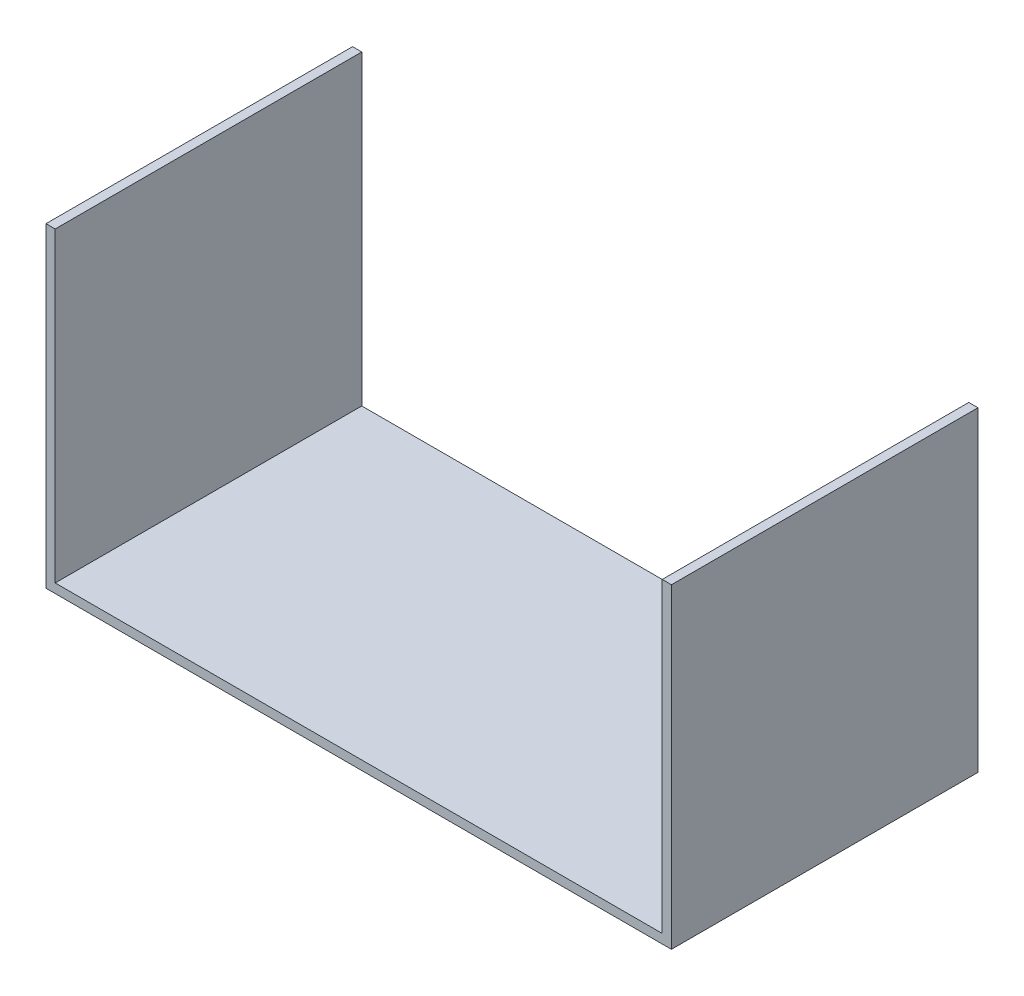
ISO-10303-21;
HEADER;
FILE_DESCRIPTION(('STEP AP214'),'2;1');
FILE_NAME('part.step','',(''),(''),'','','');
FILE_SCHEMA(('AUTOMOTIVE_DESIGN { 1 0 10303 214 1 1 1 1 }'));
ENDSEC;
DATA;
#1=APPLICATION_CONTEXT('core data for automotive mechanical design processes');
#2=APPLICATION_PROTOCOL_DEFINITION('international standard','automotive_design',2000,#1);
#3=PRODUCT_CONTEXT('',#1,'mechanical');
#4=PRODUCT('Part','Part','',(#3));
#5=PRODUCT_RELATED_PRODUCT_CATEGORY('part','',(#4));
#6=PRODUCT_DEFINITION_FORMATION('','',#4);
#7=PRODUCT_DEFINITION_CONTEXT('part definition',#1,'design');
#8=PRODUCT_DEFINITION('design','',#6,#7);
#9=PRODUCT_DEFINITION_SHAPE('','',#8);
#10=(LENGTH_UNIT() NAMED_UNIT(*) SI_UNIT(.MILLI.,.METRE.));
#11=(NAMED_UNIT(*) PLANE_ANGLE_UNIT() SI_UNIT($,.RADIAN.));
#12=(NAMED_UNIT(*) SI_UNIT($,.STERADIAN.) SOLID_ANGLE_UNIT());
#13=UNCERTAINTY_MEASURE_WITH_UNIT(LENGTH_MEASURE(1.E-05),#10,'distance_accuracy_value','');
#14=(GEOMETRIC_REPRESENTATION_CONTEXT(3) GLOBAL_UNCERTAINTY_ASSIGNED_CONTEXT((#13)) GLOBAL_UNIT_ASSIGNED_CONTEXT((#10,
#11,#12)) REPRESENTATION_CONTEXT('',''));
#15=CARTESIAN_POINT('',(0.,0.,0.));
#16=DIRECTION('',(0.,0.,1.));
#17=DIRECTION('',(1.,0.,0.));
#18=AXIS2_PLACEMENT_3D('',#15,#16,#17);
#19=CARTESIAN_POINT('',(0.,1.5,0.));
#20=DIRECTION('',(0.,-1.,0.));
#21=DIRECTION('',(0.,0.,-1.));
#22=AXIS2_PLACEMENT_3D('',#19,#20,#21);
#23=PLANE('',#22);
#24=DIRECTION('',(0.,0.,1.));
#25=VECTOR('',#24,1.);
#26=CARTESIAN_POINT('',(100.5,1.5,0.));
#27=LINE('',#26,#25);
#28=CARTESIAN_POINT('',(100.5,1.5,-50.));
#29=VERTEX_POINT('',#28);
#30=CARTESIAN_POINT('',(100.5,1.5,0.));
#31=VERTEX_POINT('',#30);
#32=EDGE_CURVE('E132',#29,#31,#27,.T.);
#33=ORIENTED_EDGE('',*,*,#32,.F.);
#34=DIRECTION('',(-1.,0.,0.));
#35=VECTOR('',#34,1.);
#36=CARTESIAN_POINT('',(0.,1.5,-50.));
#37=LINE('',#36,#35);
#38=CARTESIAN_POINT('',(1.5,1.5,-50.));
#39=VERTEX_POINT('',#38);
#40=EDGE_CURVE('E174',#29,#39,#37,.T.);
#41=ORIENTED_EDGE('',*,*,#40,.T.);
#42=DIRECTION('',(0.,0.,-1.));
#43=VECTOR('',#42,1.);
#44=CARTESIAN_POINT('',(1.5,1.5,0.));
#45=LINE('',#44,#43);
#46=CARTESIAN_POINT('',(1.5,1.5,0.));
#47=VERTEX_POINT('',#46);
#48=EDGE_CURVE('E60',#47,#39,#45,.T.);
#49=ORIENTED_EDGE('',*,*,#48,.F.);
#50=DIRECTION('',(1.,0.,0.));
#51=VECTOR('',#50,1.);
#52=CARTESIAN_POINT('',(0.,1.5,0.));
#53=LINE('',#52,#51);
#54=EDGE_CURVE('E55',#47,#31,#53,.T.);
#55=ORIENTED_EDGE('',*,*,#54,.T.);
#56=EDGE_LOOP('',(#33,#41,#49,#55));
#57=FACE_BOUND('',#56,.T.);
#58=ADVANCED_FACE('F39',(#57),#23,.F.);
#59=CARTESIAN_POINT('',(0.,1.5,0.));
#60=DIRECTION('',(1.,0.,0.));
#61=DIRECTION('',(0.,0.,-1.));
#62=AXIS2_PLACEMENT_3D('',#59,#60,#61);
#63=PLANE('',#62);
#64=DIRECTION('',(0.,0.,1.));
#65=VECTOR('',#64,1.);
#66=CARTESIAN_POINT('',(0.,0.,0.));
#67=LINE('',#66,#65);
#68=CARTESIAN_POINT('',(0.,0.,-50.));
#69=VERTEX_POINT('',#68);
#70=CARTESIAN_POINT('',(0.,0.,0.));
#71=VERTEX_POINT('',#70);
#72=EDGE_CURVE('E171',#69,#71,#67,.T.);
#73=ORIENTED_EDGE('',*,*,#72,.T.);
#74=DIRECTION('',(0.,-1.,0.));
#75=VECTOR('',#74,1.);
#76=CARTESIAN_POINT('',(0.,1.5,0.));
#77=LINE('',#76,#75);
#78=CARTESIAN_POINT('',(0.,51.5,0.));
#79=VERTEX_POINT('',#78);
#80=EDGE_CURVE('E11',#79,#71,#77,.T.);
#81=ORIENTED_EDGE('',*,*,#80,.F.);
#82=DIRECTION('',(0.,0.,1.));
#83=VECTOR('',#82,1.);
#84=CARTESIAN_POINT('',(0.,51.5,0.));
#85=LINE('',#84,#83);
#86=CARTESIAN_POINT('',(0.,51.5,-50.));
#87=VERTEX_POINT('',#86);
#88=EDGE_CURVE('E147',#87,#79,#85,.T.);
#89=ORIENTED_EDGE('',*,*,#88,.F.);
#90=DIRECTION('',(0.,-1.,0.));
#91=VECTOR('',#90,1.);
#92=CARTESIAN_POINT('',(0.,1.5,-50.));
#93=LINE('',#92,#91);
#94=EDGE_CURVE('E115',#87,#69,#93,.T.);
#95=ORIENTED_EDGE('',*,*,#94,.T.);
#96=EDGE_LOOP('',(#73,#81,#89,#95));
#97=FACE_BOUND('',#96,.T.);
#98=ADVANCED_FACE('F41',(#97),#63,.F.);
#99=CARTESIAN_POINT('',(0.,1.5,0.));
#100=DIRECTION('',(0.,0.,-1.));
#101=DIRECTION('',(-1.,0.,0.));
#102=AXIS2_PLACEMENT_3D('',#99,#100,#101);
#103=PLANE('',#102);
#104=DIRECTION('',(1.,0.,0.));
#105=VECTOR('',#104,1.);
#106=CARTESIAN_POINT('',(0.,0.,0.));
#107=LINE('',#106,#105);
#108=CARTESIAN_POINT('',(102.,0.,0.));
#109=VERTEX_POINT('',#108);
#110=EDGE_CURVE('E181',#71,#109,#107,.T.);
#111=ORIENTED_EDGE('',*,*,#110,.T.);
#112=DIRECTION('',(0.,-1.,0.));
#113=VECTOR('',#112,1.);
#114=CARTESIAN_POINT('',(102.,1.5,0.));
#115=LINE('',#114,#113);
#116=CARTESIAN_POINT('',(102.,51.5,0.));
#117=VERTEX_POINT('',#116);
#118=EDGE_CURVE('E48',#117,#109,#115,.T.);
#119=ORIENTED_EDGE('',*,*,#118,.F.);
#120=DIRECTION('',(1.,0.,0.));
#121=VECTOR('',#120,1.);
#122=CARTESIAN_POINT('',(102.,51.5,0.));
#123=LINE('',#122,#121);
#124=CARTESIAN_POINT('',(100.5,51.5,0.));
#125=VERTEX_POINT('',#124);
#126=EDGE_CURVE('E130',#125,#117,#123,.T.);
#127=ORIENTED_EDGE('',*,*,#126,.F.);
#128=DIRECTION('',(0.,-1.,0.));
#129=VECTOR('',#128,1.);
#130=CARTESIAN_POINT('',(100.5,51.5,0.));
#131=LINE('',#130,#129);
#132=EDGE_CURVE('E140',#125,#31,#131,.T.);
#133=ORIENTED_EDGE('',*,*,#132,.T.);
#134=ORIENTED_EDGE('',*,*,#54,.F.);
#135=DIRECTION('',(0.,-1.,0.));
#136=VECTOR('',#135,1.);
#137=CARTESIAN_POINT('',(1.5,51.5,0.));
#138=LINE('',#137,#136);
#139=CARTESIAN_POINT('',(1.5,51.5,0.));
#140=VERTEX_POINT('',#139);
#141=EDGE_CURVE('E167',#140,#47,#138,.T.);
#142=ORIENTED_EDGE('',*,*,#141,.F.);
#143=DIRECTION('',(1.,0.,0.));
#144=VECTOR('',#143,1.);
#145=CARTESIAN_POINT('',(0.,51.5,0.));
#146=LINE('',#145,#144);
#147=EDGE_CURVE('E151',#79,#140,#146,.T.);
#148=ORIENTED_EDGE('',*,*,#147,.F.);
#149=ORIENTED_EDGE('',*,*,#80,.T.);
#150=EDGE_LOOP('',(#111,#119,#127,#133,#134,#142,#148,#149));
#151=FACE_BOUND('',#150,.T.);
#152=ADVANCED_FACE('F206',(#151),#103,.F.);
#153=CARTESIAN_POINT('',(102.,1.5,0.));
#154=DIRECTION('',(-1.,0.,0.));
#155=DIRECTION('',(0.,0.,1.));
#156=AXIS2_PLACEMENT_3D('',#153,#154,#155);
#157=PLANE('',#156);
#158=DIRECTION('',(0.,0.,-1.));
#159=VECTOR('',#158,1.);
#160=CARTESIAN_POINT('',(102.,0.,0.));
#161=LINE('',#160,#159);
#162=CARTESIAN_POINT('',(102.,0.,-50.));
#163=VERTEX_POINT('',#162);
#164=EDGE_CURVE('E111',#109,#163,#161,.T.);
#165=ORIENTED_EDGE('',*,*,#164,.T.);
#166=DIRECTION('',(0.,-1.,0.));
#167=VECTOR('',#166,1.);
#168=CARTESIAN_POINT('',(102.,1.5,-50.));
#169=LINE('',#168,#167);
#170=CARTESIAN_POINT('',(102.,51.5,-50.));
#171=VERTEX_POINT('',#170);
#172=EDGE_CURVE('E104',#171,#163,#169,.T.);
#173=ORIENTED_EDGE('',*,*,#172,.F.);
#174=DIRECTION('',(0.,0.,-1.));
#175=VECTOR('',#174,1.);
#176=CARTESIAN_POINT('',(102.,51.5,0.));
#177=LINE('',#176,#175);
#178=EDGE_CURVE('E109',#117,#171,#177,.T.);
#179=ORIENTED_EDGE('',*,*,#178,.F.);
#180=ORIENTED_EDGE('',*,*,#118,.T.);
#181=EDGE_LOOP('',(#165,#173,#179,#180));
#182=FACE_BOUND('',#181,.T.);
#183=ADVANCED_FACE('F106',(#182),#157,.F.);
#184=CARTESIAN_POINT('',(0.,1.5,-50.));
#185=DIRECTION('',(0.,0.,1.));
#186=DIRECTION('',(1.,0.,0.));
#187=AXIS2_PLACEMENT_3D('',#184,#185,#186);
#188=PLANE('',#187);
#189=DIRECTION('',(-1.,0.,0.));
#190=VECTOR('',#189,1.);
#191=CARTESIAN_POINT('',(0.,0.,-50.));
#192=LINE('',#191,#190);
#193=EDGE_CURVE('E175',#163,#69,#192,.T.);
#194=ORIENTED_EDGE('',*,*,#193,.T.);
#195=ORIENTED_EDGE('',*,*,#94,.F.);
#196=DIRECTION('',(-1.,0.,0.));
#197=VECTOR('',#196,1.);
#198=CARTESIAN_POINT('',(0.,51.5,-50.));
#199=LINE('',#198,#197);
#200=CARTESIAN_POINT('',(1.5,51.5,-50.));
#201=VERTEX_POINT('',#200);
#202=EDGE_CURVE('E157',#201,#87,#199,.T.);
#203=ORIENTED_EDGE('',*,*,#202,.F.);
#204=DIRECTION('',(0.,-1.,0.));
#205=VECTOR('',#204,1.);
#206=CARTESIAN_POINT('',(1.5,51.5,-50.));
#207=LINE('',#206,#205);
#208=EDGE_CURVE('E161',#201,#39,#207,.T.);
#209=ORIENTED_EDGE('',*,*,#208,.T.);
#210=ORIENTED_EDGE('',*,*,#40,.F.);
#211=DIRECTION('',(0.,-1.,0.));
#212=VECTOR('',#211,1.);
#213=CARTESIAN_POINT('',(100.5,51.5,-50.));
#214=LINE('',#213,#212);
#215=CARTESIAN_POINT('',(100.5,51.5,-50.));
#216=VERTEX_POINT('',#215);
#217=EDGE_CURVE('E121',#216,#29,#214,.T.);
#218=ORIENTED_EDGE('',*,*,#217,.F.);
#219=DIRECTION('',(-1.,0.,0.));
#220=VECTOR('',#219,1.);
#221=CARTESIAN_POINT('',(102.,51.5,-50.));
#222=LINE('',#221,#220);
#223=EDGE_CURVE('E118',#171,#216,#222,.T.);
#224=ORIENTED_EDGE('',*,*,#223,.F.);
#225=ORIENTED_EDGE('',*,*,#172,.T.);
#226=EDGE_LOOP('',(#194,#195,#203,#209,#210,#218,#224,#225));
#227=FACE_BOUND('',#226,.T.);
#228=ADVANCED_FACE('F119',(#227),#188,.F.);
#229=CARTESIAN_POINT('',(0.,0.,0.));
#230=DIRECTION('',(0.,-1.,0.));
#231=DIRECTION('',(0.,0.,-1.));
#232=AXIS2_PLACEMENT_3D('',#229,#230,#231);
#233=PLANE('',#232);
#234=ORIENTED_EDGE('',*,*,#72,.F.);
#235=ORIENTED_EDGE('',*,*,#193,.F.);
#236=ORIENTED_EDGE('',*,*,#164,.F.);
#237=ORIENTED_EDGE('',*,*,#110,.F.);
#238=EDGE_LOOP('',(#234,#235,#236,#237));
#239=FACE_BOUND('',#238,.T.);
#240=ADVANCED_FACE('F194',(#239),#233,.T.);
#241=CARTESIAN_POINT('',(1.5,51.5,0.));
#242=DIRECTION('',(-1.,0.,0.));
#243=DIRECTION('',(0.,0.,1.));
#244=AXIS2_PLACEMENT_3D('',#241,#242,#243);
#245=PLANE('',#244);
#246=ORIENTED_EDGE('',*,*,#48,.T.);
#247=ORIENTED_EDGE('',*,*,#208,.F.);
#248=DIRECTION('',(0.,0.,-1.));
#249=VECTOR('',#248,1.);
#250=CARTESIAN_POINT('',(1.5,51.5,0.));
#251=LINE('',#250,#249);
#252=EDGE_CURVE('E154',#140,#201,#251,.T.);
#253=ORIENTED_EDGE('',*,*,#252,.F.);
#254=ORIENTED_EDGE('',*,*,#141,.T.);
#255=EDGE_LOOP('',(#246,#247,#253,#254));
#256=FACE_BOUND('',#255,.T.);
#257=ADVANCED_FACE('F205',(#256),#245,.F.);
#258=CARTESIAN_POINT('',(0.,51.5,0.));
#259=DIRECTION('',(0.,-1.,0.));
#260=DIRECTION('',(0.,0.,-1.));
#261=AXIS2_PLACEMENT_3D('',#258,#259,#260);
#262=PLANE('',#261);
#263=ORIENTED_EDGE('',*,*,#88,.T.);
#264=ORIENTED_EDGE('',*,*,#147,.T.);
#265=ORIENTED_EDGE('',*,*,#252,.T.);
#266=ORIENTED_EDGE('',*,*,#202,.T.);
#267=EDGE_LOOP('',(#263,#264,#265,#266));
#268=FACE_BOUND('',#267,.T.);
#269=ADVANCED_FACE('F200',(#268),#262,.F.);
#270=CARTESIAN_POINT('',(100.5,51.5,0.));
#271=DIRECTION('',(1.,0.,0.));
#272=DIRECTION('',(0.,0.,-1.));
#273=AXIS2_PLACEMENT_3D('',#270,#271,#272);
#274=PLANE('',#273);
#275=ORIENTED_EDGE('',*,*,#32,.T.);
#276=ORIENTED_EDGE('',*,*,#132,.F.);
#277=DIRECTION('',(0.,0.,1.));
#278=VECTOR('',#277,1.);
#279=CARTESIAN_POINT('',(100.5,51.5,0.));
#280=LINE('',#279,#278);
#281=EDGE_CURVE('E125',#216,#125,#280,.T.);
#282=ORIENTED_EDGE('',*,*,#281,.F.);
#283=ORIENTED_EDGE('',*,*,#217,.T.);
#284=EDGE_LOOP('',(#275,#276,#282,#283));
#285=FACE_BOUND('',#284,.T.);
#286=ADVANCED_FACE('F209',(#285),#274,.F.);
#287=CARTESIAN_POINT('',(0.,51.5,0.));
#288=DIRECTION('',(0.,1.,0.));
#289=DIRECTION('',(0.,0.,1.));
#290=AXIS2_PLACEMENT_3D('',#287,#288,#289);
#291=PLANE('',#290);
#292=ORIENTED_EDGE('',*,*,#178,.T.);
#293=ORIENTED_EDGE('',*,*,#223,.T.);
#294=ORIENTED_EDGE('',*,*,#281,.T.);
#295=ORIENTED_EDGE('',*,*,#126,.T.);
#296=EDGE_LOOP('',(#292,#293,#294,#295));
#297=FACE_BOUND('',#296,.T.);
#298=ADVANCED_FACE('F128',(#297),#291,.T.);
#299=CLOSED_SHELL('',(#58,#98,#152,#183,#228,#240,#257,#269,#286,#298));
#300=MANIFOLD_SOLID_BREP('B2',#299);
#301=ADVANCED_BREP_SHAPE_REPRESENTATION('',(#18,#300),#14);
#302=SHAPE_DEFINITION_REPRESENTATION(#9,#301);
ENDSEC;
END-ISO-10303-21;
